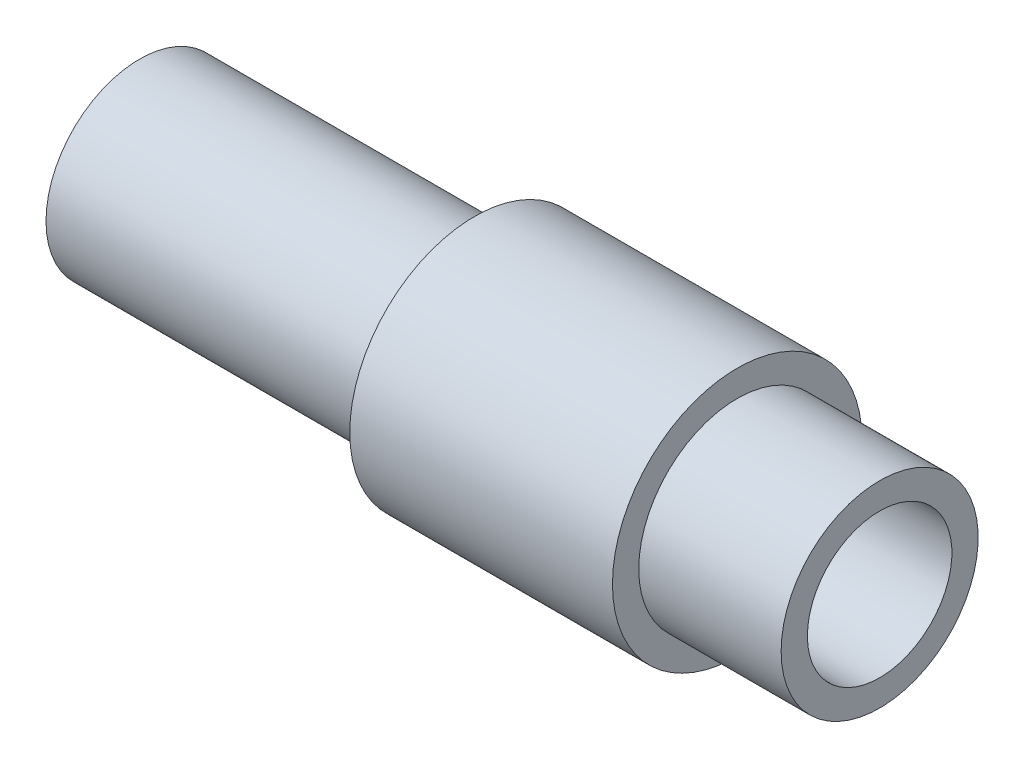
ISO-10303-21;
HEADER;
FILE_DESCRIPTION(('STEP AP214'),'2;1');
FILE_NAME('part.step','',(''),(''),'','','');
FILE_SCHEMA(('AUTOMOTIVE_DESIGN { 1 0 10303 214 1 1 1 1 }'));
ENDSEC;
DATA;
#1=APPLICATION_CONTEXT('core data for automotive mechanical design processes');
#2=APPLICATION_PROTOCOL_DEFINITION('international standard','automotive_design',2000,#1);
#3=PRODUCT_CONTEXT('',#1,'mechanical');
#4=PRODUCT('Part','Part','',(#3));
#5=PRODUCT_RELATED_PRODUCT_CATEGORY('part','',(#4));
#6=PRODUCT_DEFINITION_FORMATION('','',#4);
#7=PRODUCT_DEFINITION_CONTEXT('part definition',#1,'design');
#8=PRODUCT_DEFINITION('design','',#6,#7);
#9=PRODUCT_DEFINITION_SHAPE('','',#8);
#10=(LENGTH_UNIT() NAMED_UNIT(*) SI_UNIT(.MILLI.,.METRE.));
#11=(NAMED_UNIT(*) PLANE_ANGLE_UNIT() SI_UNIT($,.RADIAN.));
#12=(NAMED_UNIT(*) SI_UNIT($,.STERADIAN.) SOLID_ANGLE_UNIT());
#13=UNCERTAINTY_MEASURE_WITH_UNIT(LENGTH_MEASURE(1.E-05),#10,'distance_accuracy_value','');
#14=(GEOMETRIC_REPRESENTATION_CONTEXT(3) GLOBAL_UNCERTAINTY_ASSIGNED_CONTEXT((#13)) GLOBAL_UNIT_ASSIGNED_CONTEXT((#10,
#11,#12)) REPRESENTATION_CONTEXT('',''));
#15=CARTESIAN_POINT('',(0.,0.,0.));
#16=DIRECTION('',(0.,0.,1.));
#17=DIRECTION('',(1.,0.,0.));
#18=AXIS2_PLACEMENT_3D('',#15,#16,#17);
#19=CARTESIAN_POINT('',(-72.1427322201696,26.757857647235,0.));
#20=DIRECTION('',(1.,0.,0.));
#21=DIRECTION('',(0.,0.,-1.));
#22=AXIS2_PLACEMENT_3D('',#19,#20,#21);
#23=PLANE('',#22);
#24=CARTESIAN_POINT('',(-72.1427322201696,19.632857647235,0.));
#25=DIRECTION('',(-1.,0.,0.));
#26=DIRECTION('',(0.,0.,1.));
#27=AXIS2_PLACEMENT_3D('',#24,#25,#26);
#28=CIRCLE('',#27,5.125);
#29=CARTESIAN_POINT('',(-72.1427322201696,19.632857647235,5.125));
#30=VERTEX_POINT('',#29);
#31=EDGE_CURVE('E10',#30,#30,#28,.T.);
#32=ORIENTED_EDGE('',*,*,#31,.F.);
#33=EDGE_LOOP('',(#32));
#34=FACE_BOUND('',#33,.T.);
#35=CARTESIAN_POINT('',(-72.1427322201696,19.632857647235,0.));
#36=DIRECTION('',(-1.,0.,0.));
#37=DIRECTION('',(0.,0.,1.));
#38=AXIS2_PLACEMENT_3D('',#35,#36,#37);
#39=CIRCLE('',#38,7.125);
#40=CARTESIAN_POINT('',(-72.1427322201696,19.632857647235,7.125));
#41=VERTEX_POINT('',#40);
#42=EDGE_CURVE('E88',#41,#41,#39,.T.);
#43=ORIENTED_EDGE('',*,*,#42,.T.);
#44=EDGE_LOOP('',(#43));
#45=FACE_BOUND('',#44,.T.);
#46=ADVANCED_FACE('F37',(#34,#45),#23,.F.);
#47=CARTESIAN_POINT('',(-83.6737426979836,19.632857647235,0.));
#48=DIRECTION('',(-1.,0.,0.));
#49=DIRECTION('',(0.,0.,1.));
#50=AXIS2_PLACEMENT_3D('',#47,#48,#49);
#51=CYLINDRICAL_SURFACE('',#50,5.125);
#52=CARTESIAN_POINT('',(-44.6427322201696,19.632857647235,0.));
#53=DIRECTION('',(-1.,0.,0.));
#54=DIRECTION('',(0.,0.,1.));
#55=AXIS2_PLACEMENT_3D('',#52,#53,#54);
#56=CIRCLE('',#55,5.125);
#57=CARTESIAN_POINT('',(-44.6427322201696,19.632857647235,5.125));
#58=VERTEX_POINT('',#57);
#59=EDGE_CURVE('E44',#58,#58,#56,.T.);
#60=ORIENTED_EDGE('',*,*,#59,.F.);
#61=EDGE_LOOP('',(#60));
#62=FACE_BOUND('',#61,.T.);
#63=ORIENTED_EDGE('',*,*,#31,.T.);
#64=EDGE_LOOP('',(#63));
#65=FACE_BOUND('',#64,.T.);
#66=ADVANCED_FACE('F150',(#62,#65),#51,.F.);
#67=CARTESIAN_POINT('',(-44.6427322201696,24.757857647235,0.));
#68=DIRECTION('',(-1.,0.,0.));
#69=DIRECTION('',(0.,0.,1.));
#70=AXIS2_PLACEMENT_3D('',#67,#68,#69);
#71=PLANE('',#70);
#72=CARTESIAN_POINT('',(-44.6427322201696,19.632857647235,0.));
#73=DIRECTION('',(-1.,0.,0.));
#74=DIRECTION('',(0.,0.,1.));
#75=AXIS2_PLACEMENT_3D('',#72,#73,#74);
#76=CIRCLE('',#75,7.5);
#77=CARTESIAN_POINT('',(-44.6427322201696,19.632857647235,7.5));
#78=VERTEX_POINT('',#77);
#79=EDGE_CURVE('E49',#78,#78,#76,.T.);
#80=ORIENTED_EDGE('',*,*,#79,.F.);
#81=EDGE_LOOP('',(#80));
#82=FACE_BOUND('',#81,.T.);
#83=ORIENTED_EDGE('',*,*,#59,.T.);
#84=EDGE_LOOP('',(#83));
#85=FACE_BOUND('',#84,.T.);
#86=ADVANCED_FACE('F145',(#82,#85),#71,.F.);
#87=CARTESIAN_POINT('',(-83.6737426979836,19.632857647235,0.));
#88=DIRECTION('',(-1.,0.,0.));
#89=DIRECTION('',(0.,0.,1.));
#90=AXIS2_PLACEMENT_3D('',#87,#88,#89);
#91=CYLINDRICAL_SURFACE('',#90,7.5);
#92=CARTESIAN_POINT('',(-28.6427322201696,19.632857647235,0.));
#93=DIRECTION('',(-1.,0.,0.));
#94=DIRECTION('',(0.,0.,1.));
#95=AXIS2_PLACEMENT_3D('',#92,#93,#94);
#96=CIRCLE('',#95,7.5);
#97=CARTESIAN_POINT('',(-28.6427322201696,19.632857647235,7.5));
#98=VERTEX_POINT('',#97);
#99=EDGE_CURVE('E54',#98,#98,#96,.T.);
#100=ORIENTED_EDGE('',*,*,#99,.F.);
#101=EDGE_LOOP('',(#100));
#102=FACE_BOUND('',#101,.T.);
#103=ORIENTED_EDGE('',*,*,#79,.T.);
#104=EDGE_LOOP('',(#103));
#105=FACE_BOUND('',#104,.T.);
#106=ADVANCED_FACE('F139',(#102,#105),#91,.F.);
#107=CARTESIAN_POINT('',(-28.6427322201696,27.132857647235,0.));
#108=DIRECTION('',(1.,0.,0.));
#109=DIRECTION('',(0.,0.,-1.));
#110=AXIS2_PLACEMENT_3D('',#107,#108,#109);
#111=PLANE('',#110);
#112=CARTESIAN_POINT('',(-28.6427322201696,19.632857647235,0.));
#113=DIRECTION('',(-1.,0.,0.));
#114=DIRECTION('',(0.,0.,1.));
#115=AXIS2_PLACEMENT_3D('',#112,#113,#114);
#116=CIRCLE('',#115,5.5);
#117=CARTESIAN_POINT('',(-28.6427322201696,19.632857647235,5.5));
#118=VERTEX_POINT('',#117);
#119=EDGE_CURVE('E60',#118,#118,#116,.T.);
#120=ORIENTED_EDGE('',*,*,#119,.F.);
#121=EDGE_LOOP('',(#120));
#122=FACE_BOUND('',#121,.T.);
#123=ORIENTED_EDGE('',*,*,#99,.T.);
#124=EDGE_LOOP('',(#123));
#125=FACE_BOUND('',#124,.T.);
#126=ADVANCED_FACE('F133',(#122,#125),#111,.F.);
#127=CARTESIAN_POINT('',(-83.6737426979836,19.632857647235,0.));
#128=DIRECTION('',(-1.,0.,0.));
#129=DIRECTION('',(0.,0.,1.));
#130=AXIS2_PLACEMENT_3D('',#127,#128,#129);
#131=CYLINDRICAL_SURFACE('',#130,5.5);
#132=CARTESIAN_POINT('',(-15.8034961508885,19.632857647235,0.));
#133=DIRECTION('',(-1.,0.,0.));
#134=DIRECTION('',(0.,0.,1.));
#135=AXIS2_PLACEMENT_3D('',#132,#133,#134);
#136=CIRCLE('',#135,5.5);
#137=CARTESIAN_POINT('',(-15.8034961508885,19.632857647235,5.5));
#138=VERTEX_POINT('',#137);
#139=EDGE_CURVE('E64',#138,#138,#136,.T.);
#140=ORIENTED_EDGE('',*,*,#139,.F.);
#141=EDGE_LOOP('',(#140));
#142=FACE_BOUND('',#141,.T.);
#143=ORIENTED_EDGE('',*,*,#119,.T.);
#144=EDGE_LOOP('',(#143));
#145=FACE_BOUND('',#144,.T.);
#146=ADVANCED_FACE('F127',(#142,#145),#131,.F.);
#147=CARTESIAN_POINT('',(-15.8034961508885,27.132857647235,0.));
#148=DIRECTION('',(-1.,0.,0.));
#149=DIRECTION('',(0.,0.,1.));
#150=AXIS2_PLACEMENT_3D('',#147,#148,#149);
#151=PLANE('',#150);
#152=CARTESIAN_POINT('',(-15.8034961508885,19.632857647235,0.));
#153=DIRECTION('',(-1.,0.,0.));
#154=DIRECTION('',(0.,0.,1.));
#155=AXIS2_PLACEMENT_3D('',#152,#153,#154);
#156=CIRCLE('',#155,7.5);
#157=CARTESIAN_POINT('',(-15.8034961508885,19.632857647235,7.5));
#158=VERTEX_POINT('',#157);
#159=EDGE_CURVE('E68',#158,#158,#156,.T.);
#160=ORIENTED_EDGE('',*,*,#159,.F.);
#161=EDGE_LOOP('',(#160));
#162=FACE_BOUND('',#161,.T.);
#163=ORIENTED_EDGE('',*,*,#139,.T.);
#164=EDGE_LOOP('',(#163));
#165=FACE_BOUND('',#164,.T.);
#166=ADVANCED_FACE('F121',(#162,#165),#151,.F.);
#167=CARTESIAN_POINT('',(-83.6737426979836,19.632857647235,0.));
#168=DIRECTION('',(-1.,0.,0.));
#169=DIRECTION('',(0.,0.,1.));
#170=AXIS2_PLACEMENT_3D('',#167,#168,#169);
#171=CYLINDRICAL_SURFACE('',#170,7.5);
#172=CARTESIAN_POINT('',(-26.6427322201696,19.632857647235,0.));
#173=DIRECTION('',(-1.,0.,0.));
#174=DIRECTION('',(0.,0.,1.));
#175=AXIS2_PLACEMENT_3D('',#172,#173,#174);
#176=CIRCLE('',#175,7.5);
#177=CARTESIAN_POINT('',(-26.6427322201696,19.632857647235,7.5));
#178=VERTEX_POINT('',#177);
#179=EDGE_CURVE('E72',#178,#178,#176,.T.);
#180=ORIENTED_EDGE('',*,*,#179,.F.);
#181=EDGE_LOOP('',(#180));
#182=FACE_BOUND('',#181,.T.);
#183=ORIENTED_EDGE('',*,*,#159,.T.);
#184=EDGE_LOOP('',(#183));
#185=FACE_BOUND('',#184,.T.);
#186=ADVANCED_FACE('F115',(#182,#185),#171,.T.);
#187=CARTESIAN_POINT('',(-26.6427322201696,29.132857647235,0.));
#188=DIRECTION('',(-1.,0.,0.));
#189=DIRECTION('',(0.,0.,1.));
#190=AXIS2_PLACEMENT_3D('',#187,#188,#189);
#191=PLANE('',#190);
#192=CARTESIAN_POINT('',(-26.6427322201696,19.632857647235,0.));
#193=DIRECTION('',(-1.,0.,0.));
#194=DIRECTION('',(0.,0.,1.));
#195=AXIS2_PLACEMENT_3D('',#192,#193,#194);
#196=CIRCLE('',#195,9.5);
#197=CARTESIAN_POINT('',(-26.6427322201696,19.632857647235,9.5));
#198=VERTEX_POINT('',#197);
#199=EDGE_CURVE('E76',#198,#198,#196,.T.);
#200=ORIENTED_EDGE('',*,*,#199,.F.);
#201=EDGE_LOOP('',(#200));
#202=FACE_BOUND('',#201,.T.);
#203=ORIENTED_EDGE('',*,*,#179,.T.);
#204=EDGE_LOOP('',(#203));
#205=FACE_BOUND('',#204,.T.);
#206=ADVANCED_FACE('F109',(#202,#205),#191,.F.);
#207=CARTESIAN_POINT('',(-83.6737426979836,19.632857647235,0.));
#208=DIRECTION('',(-1.,0.,0.));
#209=DIRECTION('',(0.,0.,1.));
#210=AXIS2_PLACEMENT_3D('',#207,#208,#209);
#211=CYLINDRICAL_SURFACE('',#210,9.5);
#212=CARTESIAN_POINT('',(-46.6427322201696,19.632857647235,0.));
#213=DIRECTION('',(-1.,0.,0.));
#214=DIRECTION('',(0.,0.,1.));
#215=AXIS2_PLACEMENT_3D('',#212,#213,#214);
#216=CIRCLE('',#215,9.5);
#217=CARTESIAN_POINT('',(-46.6427322201696,19.632857647235,9.5));
#218=VERTEX_POINT('',#217);
#219=EDGE_CURVE('E80',#218,#218,#216,.T.);
#220=ORIENTED_EDGE('',*,*,#219,.F.);
#221=EDGE_LOOP('',(#220));
#222=FACE_BOUND('',#221,.T.);
#223=ORIENTED_EDGE('',*,*,#199,.T.);
#224=EDGE_LOOP('',(#223));
#225=FACE_BOUND('',#224,.T.);
#226=ADVANCED_FACE('F103',(#222,#225),#211,.T.);
#227=CARTESIAN_POINT('',(-46.6427322201696,26.757857647235,0.));
#228=DIRECTION('',(1.,0.,0.));
#229=DIRECTION('',(0.,0.,-1.));
#230=AXIS2_PLACEMENT_3D('',#227,#228,#229);
#231=PLANE('',#230);
#232=CARTESIAN_POINT('',(-46.6427322201696,19.632857647235,0.));
#233=DIRECTION('',(-1.,0.,0.));
#234=DIRECTION('',(0.,0.,1.));
#235=AXIS2_PLACEMENT_3D('',#232,#233,#234);
#236=CIRCLE('',#235,7.125);
#237=CARTESIAN_POINT('',(-46.6427322201696,19.632857647235,7.125));
#238=VERTEX_POINT('',#237);
#239=EDGE_CURVE('E84',#238,#238,#236,.T.);
#240=ORIENTED_EDGE('',*,*,#239,.F.);
#241=EDGE_LOOP('',(#240));
#242=FACE_BOUND('',#241,.T.);
#243=ORIENTED_EDGE('',*,*,#219,.T.);
#244=EDGE_LOOP('',(#243));
#245=FACE_BOUND('',#244,.T.);
#246=ADVANCED_FACE('F97',(#242,#245),#231,.F.);
#247=CARTESIAN_POINT('',(-83.6737426979836,19.632857647235,0.));
#248=DIRECTION('',(-1.,0.,0.));
#249=DIRECTION('',(0.,0.,1.));
#250=AXIS2_PLACEMENT_3D('',#247,#248,#249);
#251=CYLINDRICAL_SURFACE('',#250,7.125);
#252=ORIENTED_EDGE('',*,*,#42,.F.);
#253=EDGE_LOOP('',(#252));
#254=FACE_BOUND('',#253,.T.);
#255=ORIENTED_EDGE('',*,*,#239,.T.);
#256=EDGE_LOOP('',(#255));
#257=FACE_BOUND('',#256,.T.);
#258=ADVANCED_FACE('F94',(#254,#257),#251,.T.);
#259=CLOSED_SHELL('',(#46,#66,#86,#106,#126,#146,#166,#186,#206,#226,#246,#258));
#260=MANIFOLD_SOLID_BREP('B2',#259);
#261=ADVANCED_BREP_SHAPE_REPRESENTATION('',(#18,#260),#14);
#262=SHAPE_DEFINITION_REPRESENTATION(#9,#261);
ENDSEC;
END-ISO-10303-21;
